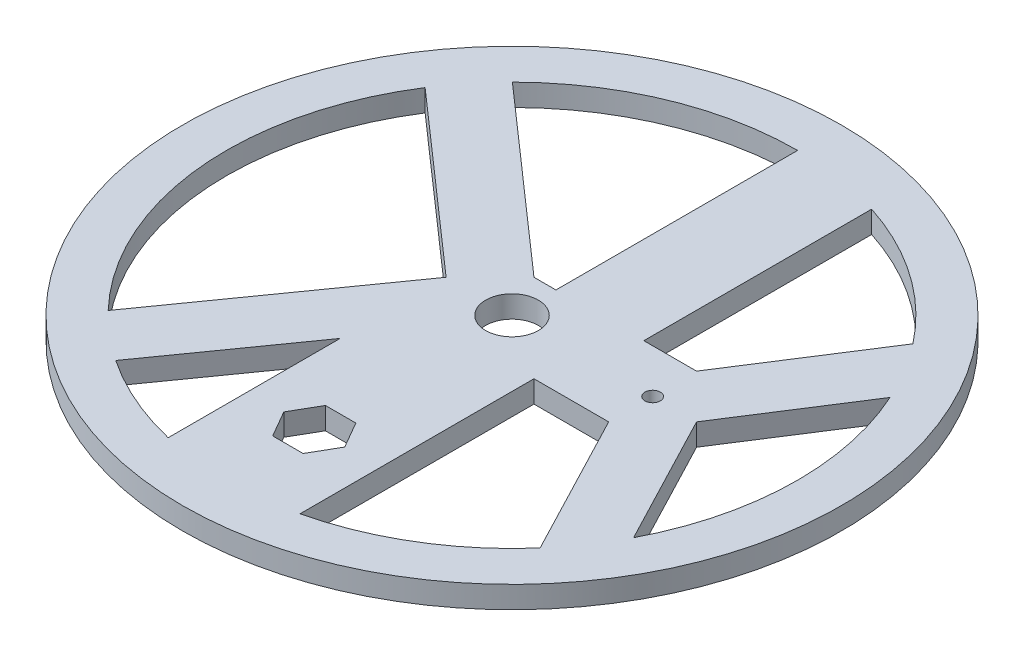
ISO-10303-21;
HEADER;
FILE_DESCRIPTION(('STEP AP214'),'2;1');
FILE_NAME('part.step','',(''),(''),'','','');
FILE_SCHEMA(('AUTOMOTIVE_DESIGN { 1 0 10303 214 1 1 1 1 }'));
ENDSEC;
DATA;
#1=APPLICATION_CONTEXT('core data for automotive mechanical design processes');
#2=APPLICATION_PROTOCOL_DEFINITION('international standard','automotive_design',2000,#1);
#3=PRODUCT_CONTEXT('',#1,'mechanical');
#4=PRODUCT('Part','Part','',(#3));
#5=PRODUCT_RELATED_PRODUCT_CATEGORY('part','',(#4));
#6=PRODUCT_DEFINITION_FORMATION('','',#4);
#7=PRODUCT_DEFINITION_CONTEXT('part definition',#1,'design');
#8=PRODUCT_DEFINITION('design','',#6,#7);
#9=PRODUCT_DEFINITION_SHAPE('','',#8);
#10=(LENGTH_UNIT() NAMED_UNIT(*) SI_UNIT(.MILLI.,.METRE.));
#11=(NAMED_UNIT(*) PLANE_ANGLE_UNIT() SI_UNIT($,.RADIAN.));
#12=(NAMED_UNIT(*) SI_UNIT($,.STERADIAN.) SOLID_ANGLE_UNIT());
#13=UNCERTAINTY_MEASURE_WITH_UNIT(LENGTH_MEASURE(1.E-05),#10,'distance_accuracy_value','');
#14=(GEOMETRIC_REPRESENTATION_CONTEXT(3) GLOBAL_UNCERTAINTY_ASSIGNED_CONTEXT((#13)) GLOBAL_UNIT_ASSIGNED_CONTEXT((#10,
#11,#12)) REPRESENTATION_CONTEXT('',''));
#15=CARTESIAN_POINT('',(0.,0.,0.));
#16=DIRECTION('',(0.,0.,1.));
#17=DIRECTION('',(1.,0.,0.));
#18=AXIS2_PLACEMENT_3D('',#15,#16,#17);
#19=CARTESIAN_POINT('',(0.,5.,0.));
#20=DIRECTION('',(0.,1.,0.));
#21=DIRECTION('',(0.,0.,1.));
#22=AXIS2_PLACEMENT_3D('',#19,#20,#21);
#23=PLANE('',#22);
#24=DIRECTION('',(0.,0.,1.));
#25=VECTOR('',#24,1.);
#26=CARTESIAN_POINT('',(15.,5.,0.));
#27=LINE('',#26,#25);
#28=CARTESIAN_POINT('',(15.,5.,10.));
#29=VERTEX_POINT('',#28);
#30=CARTESIAN_POINT('',(15.,5.,63.2455532033676));
#31=VERTEX_POINT('',#30);
#32=EDGE_CURVE('E134',#29,#31,#27,.T.);
#33=ORIENTED_EDGE('',*,*,#32,.F.);
#34=DIRECTION('',(1.,0.,0.));
#35=VECTOR('',#34,1.);
#36=CARTESIAN_POINT('',(0.,5.,10.));
#37=LINE('',#36,#35);
#38=CARTESIAN_POINT('',(32.,5.,10.));
#39=VERTEX_POINT('',#38);
#40=EDGE_CURVE('E358',#29,#39,#37,.T.);
#41=ORIENTED_EDGE('',*,*,#40,.T.);
#42=DIRECTION('',(0.462813092715628,0.,0.886455887910389));
#43=VECTOR('',#42,1.);
#44=CARTESIAN_POINT('',(21.043095408354,5.,-10.9864689253831));
#45=LINE('',#44,#43);
#46=CARTESIAN_POINT('',(49.0480133056651,5.,42.6531639010202));
#47=VERTEX_POINT('',#46);
#48=EDGE_CURVE('E371',#39,#47,#45,.T.);
#49=ORIENTED_EDGE('',*,*,#48,.T.);
#50=CARTESIAN_POINT('',(0.,5.,0.));
#51=DIRECTION('',(0.,1.,0.));
#52=DIRECTION('',(0.,0.,1.));
#53=AXIS2_PLACEMENT_3D('',#50,#51,#52);
#54=CIRCLE('',#53,65.);
#55=EDGE_CURVE('E368',#31,#47,#54,.T.);
#56=ORIENTED_EDGE('',*,*,#55,.F.);
#57=EDGE_LOOP('',(#33,#41,#49,#56));
#58=FACE_BOUND('',#57,.T.);
#59=DIRECTION('',(0.462813092715629,0.,0.886455887910388));
#60=VECTOR('',#59,1.);
#61=CARTESIAN_POINT('',(33.0037697308618,5.,-17.231062423671));
#62=LINE('',#61,#60);
#63=CARTESIAN_POINT('',(42.,5.,0.));
#64=VERTEX_POINT('',#63);
#65=CARTESIAN_POINT('',(57.662812973354,5.,30.));
#66=VERTEX_POINT('',#65);
#67=EDGE_CURVE('E142',#64,#66,#62,.T.);
#68=ORIENTED_EDGE('',*,*,#67,.F.);
#69=DIRECTION('',(0.539745359981986,0.,-0.84182833545677));
#70=VECTOR('',#69,1.);
#71=CARTESIAN_POINT('',(29.7643477478725,5.,19.0836633944943));
#72=LINE('',#71,#70);
#73=CARTESIAN_POINT('',(59.2034738048556,5.,-26.8318595970868));
#74=VERTEX_POINT('',#73);
#75=EDGE_CURVE('E336',#64,#74,#72,.T.);
#76=ORIENTED_EDGE('',*,*,#75,.T.);
#77=CARTESIAN_POINT('',(0.,5.,0.));
#78=DIRECTION('',(0.,1.,0.));
#79=DIRECTION('',(0.,0.,1.));
#80=AXIS2_PLACEMENT_3D('',#77,#78,#79);
#81=CIRCLE('',#80,65.);
#82=EDGE_CURVE('E344',#66,#74,#81,.T.);
#83=ORIENTED_EDGE('',*,*,#82,.F.);
#84=EDGE_LOOP('',(#68,#76,#83));
#85=FACE_BOUND('',#84,.T.);
#86=DIRECTION('',(0.539745359981986,0.,-0.84182833545677));
#87=VECTOR('',#86,1.);
#88=CARTESIAN_POINT('',(18.1338689044518,5.,11.626683478632));
#89=LINE('',#88,#87);
#90=CARTESIAN_POINT('',(32.,5.,-10.));
#91=VERTEX_POINT('',#90);
#92=CARTESIAN_POINT('',(51.234753829798,5.,-40.));
#93=VERTEX_POINT('',#92);
#94=EDGE_CURVE('E378',#91,#93,#89,.T.);
#95=ORIENTED_EDGE('',*,*,#94,.F.);
#96=DIRECTION('',(1.,0.,0.));
#97=VECTOR('',#96,1.);
#98=CARTESIAN_POINT('',(0.,5.,-10.));
#99=LINE('',#98,#97);
#100=CARTESIAN_POINT('',(20.,5.,-10.));
#101=VERTEX_POINT('',#100);
#102=EDGE_CURVE('E422',#101,#91,#99,.T.);
#103=ORIENTED_EDGE('',*,*,#102,.F.);
#104=DIRECTION('',(0.,0.,-1.));
#105=VECTOR('',#104,1.);
#106=CARTESIAN_POINT('',(20.,5.,0.));
#107=LINE('',#106,#105);
#108=CARTESIAN_POINT('',(20.,5.,-61.8465843842649));
#109=VERTEX_POINT('',#108);
#110=EDGE_CURVE('E436',#101,#109,#107,.T.);
#111=ORIENTED_EDGE('',*,*,#110,.T.);
#112=CARTESIAN_POINT('',(0.,5.,0.));
#113=DIRECTION('',(0.,1.,0.));
#114=DIRECTION('',(0.,0.,1.));
#115=AXIS2_PLACEMENT_3D('',#112,#113,#114);
#116=CIRCLE('',#115,65.);
#117=EDGE_CURVE('E433',#93,#109,#116,.T.);
#118=ORIENTED_EDGE('',*,*,#117,.F.);
#119=EDGE_LOOP('',(#95,#103,#111,#118));
#120=FACE_BOUND('',#119,.T.);
#121=DIRECTION('',(0.,0.,-1.));
#122=VECTOR('',#121,1.);
#123=CARTESIAN_POINT('',(0.,5.,0.));
#124=LINE('',#123,#122);
#125=CARTESIAN_POINT('',(0.,5.,-10.));
#126=VERTEX_POINT('',#125);
#127=CARTESIAN_POINT('',(0.,5.,-65.));
#128=VERTEX_POINT('',#127);
#129=EDGE_CURVE('E398',#126,#128,#124,.T.);
#130=ORIENTED_EDGE('',*,*,#129,.F.);
#131=DIRECTION('',(1.,0.,0.));
#132=VECTOR('',#131,1.);
#133=CARTESIAN_POINT('',(0.,5.,-10.));
#134=LINE('',#133,#132);
#135=CARTESIAN_POINT('',(-5.,5.,-10.));
#136=VERTEX_POINT('',#135);
#137=EDGE_CURVE('E388',#136,#126,#134,.T.);
#138=ORIENTED_EDGE('',*,*,#137,.F.);
#139=DIRECTION('',(-0.750709632654764,0.,-0.66063230880676));
#140=VECTOR('',#139,1.);
#141=CARTESIAN_POINT('',(2.77725514144516,5.,-3.15593433628555));
#142=LINE('',#141,#140);
#143=CARTESIAN_POINT('',(-45.9167075544969,5.,-46.0071295274418));
#144=VERTEX_POINT('',#143);
#145=EDGE_CURVE('E404',#136,#144,#142,.T.);
#146=ORIENTED_EDGE('',*,*,#145,.T.);
#147=CARTESIAN_POINT('',(0.,5.,0.));
#148=DIRECTION('',(0.,1.,0.));
#149=DIRECTION('',(0.,0.,1.));
#150=AXIS2_PLACEMENT_3D('',#147,#148,#149);
#151=CIRCLE('',#150,65.);
#152=EDGE_CURVE('E400',#128,#144,#151,.T.);
#153=ORIENTED_EDGE('',*,*,#152,.F.);
#154=EDGE_LOOP('',(#130,#138,#146,#153));
#155=FACE_BOUND('',#154,.T.);
#156=DIRECTION('',(-0.57836926543929,0.,0.815775087138125));
#157=VECTOR('',#156,1.);
#158=CARTESIAN_POINT('',(1.39074741514143,5.,0.986013882489091));
#159=LINE('',#158,#157);
#160=CARTESIAN_POINT('',(-15.,5.,24.1047447692179));
#161=VERTEX_POINT('',#160);
#162=CARTESIAN_POINT('',(-36.1903220489352,5.,53.9931531769942));
#163=VERTEX_POINT('',#162);
#164=EDGE_CURVE('E305',#161,#163,#159,.T.);
#165=ORIENTED_EDGE('',*,*,#164,.F.);
#166=DIRECTION('',(0.,0.,1.));
#167=VECTOR('',#166,1.);
#168=CARTESIAN_POINT('',(-15.,5.,0.));
#169=LINE('',#168,#167);
#170=CARTESIAN_POINT('',(-15.,5.,63.2455532033676));
#171=VERTEX_POINT('',#170);
#172=EDGE_CURVE('E320',#161,#171,#169,.T.);
#173=ORIENTED_EDGE('',*,*,#172,.T.);
#174=CARTESIAN_POINT('',(0.,5.,0.));
#175=DIRECTION('',(0.,1.,0.));
#176=DIRECTION('',(0.,0.,1.));
#177=AXIS2_PLACEMENT_3D('',#174,#175,#176);
#178=CIRCLE('',#177,65.);
#179=EDGE_CURVE('E323',#163,#171,#178,.T.);
#180=ORIENTED_EDGE('',*,*,#179,.F.);
#181=EDGE_LOOP('',(#165,#173,#180));
#182=FACE_BOUND('',#181,.T.);
#183=DIRECTION('',(0.5,0.,-0.866025403784439));
#184=VECTOR('',#183,1.);
#185=CARTESIAN_POINT('',(3.46410161513776,5.,51.));
#186=LINE('',#185,#184);
#187=CARTESIAN_POINT('',(3.46410161513776,5.,51.));
#188=VERTEX_POINT('',#187);
#189=CARTESIAN_POINT('',(6.92820323027551,5.,45.));
#190=VERTEX_POINT('',#189);
#191=EDGE_CURVE('E481',#188,#190,#186,.T.);
#192=ORIENTED_EDGE('',*,*,#191,.F.);
#193=DIRECTION('',(1.,0.,0.));
#194=VECTOR('',#193,1.);
#195=CARTESIAN_POINT('',(-3.46410161513776,5.,51.));
#196=LINE('',#195,#194);
#197=CARTESIAN_POINT('',(-3.46410161513776,5.,51.));
#198=VERTEX_POINT('',#197);
#199=EDGE_CURVE('E479',#198,#188,#196,.T.);
#200=ORIENTED_EDGE('',*,*,#199,.F.);
#201=DIRECTION('',(0.5,0.,0.866025403784439));
#202=VECTOR('',#201,1.);
#203=CARTESIAN_POINT('',(-6.92820323027552,5.,45.));
#204=LINE('',#203,#202);
#205=CARTESIAN_POINT('',(-6.92820323027552,5.,45.));
#206=VERTEX_POINT('',#205);
#207=EDGE_CURVE('E491',#206,#198,#204,.T.);
#208=ORIENTED_EDGE('',*,*,#207,.F.);
#209=DIRECTION('',(-0.5,0.,0.866025403784439));
#210=VECTOR('',#209,1.);
#211=CARTESIAN_POINT('',(-3.46410161513776,5.,39.));
#212=LINE('',#211,#210);
#213=CARTESIAN_POINT('',(-3.46410161513776,5.,39.));
#214=VERTEX_POINT('',#213);
#215=EDGE_CURVE('E488',#214,#206,#212,.T.);
#216=ORIENTED_EDGE('',*,*,#215,.F.);
#217=DIRECTION('',(-1.,0.,0.));
#218=VECTOR('',#217,1.);
#219=CARTESIAN_POINT('',(3.46410161513775,5.,39.));
#220=LINE('',#219,#218);
#221=CARTESIAN_POINT('',(3.46410161513775,5.,39.));
#222=VERTEX_POINT('',#221);
#223=EDGE_CURVE('E486',#222,#214,#220,.T.);
#224=ORIENTED_EDGE('',*,*,#223,.F.);
#225=DIRECTION('',(-0.5,0.,-0.866025403784439));
#226=VECTOR('',#225,1.);
#227=CARTESIAN_POINT('',(6.92820323027551,5.,45.));
#228=LINE('',#227,#226);
#229=EDGE_CURVE('E484',#190,#222,#228,.T.);
#230=ORIENTED_EDGE('',*,*,#229,.F.);
#231=EDGE_LOOP('',(#192,#200,#208,#216,#224,#230));
#232=FACE_BOUND('',#231,.T.);
#233=CARTESIAN_POINT('',(32.,5.,0.));
#234=DIRECTION('',(0.,1.,0.));
#235=DIRECTION('',(0.,0.,1.));
#236=AXIS2_PLACEMENT_3D('',#233,#234,#235);
#237=CIRCLE('',#236,1.75);
#238=CARTESIAN_POINT('',(32.,5.,1.75));
#239=VERTEX_POINT('',#238);
#240=EDGE_CURVE('E524',#239,#239,#237,.T.);
#241=ORIENTED_EDGE('',*,*,#240,.F.);
#242=EDGE_LOOP('',(#241));
#243=FACE_BOUND('',#242,.T.);
#244=CARTESIAN_POINT('',(0.,5.,0.));
#245=DIRECTION('',(0.,1.,0.));
#246=DIRECTION('',(0.,0.,1.));
#247=AXIS2_PLACEMENT_3D('',#244,#245,#246);
#248=CIRCLE('',#247,75.);
#249=CARTESIAN_POINT('',(0.,5.,75.));
#250=VERTEX_POINT('',#249);
#251=EDGE_CURVE('E12',#250,#250,#248,.T.);
#252=ORIENTED_EDGE('',*,*,#251,.T.);
#253=EDGE_LOOP('',(#252));
#254=FACE_BOUND('',#253,.T.);
#255=CARTESIAN_POINT('',(0.,5.,0.));
#256=DIRECTION('',(0.,1.,0.));
#257=DIRECTION('',(0.,0.,1.));
#258=AXIS2_PLACEMENT_3D('',#255,#256,#257);
#259=CIRCLE('',#258,6.);
#260=CARTESIAN_POINT('',(0.,5.,6.));
#261=VERTEX_POINT('',#260);
#262=EDGE_CURVE('E473',#261,#261,#259,.T.);
#263=ORIENTED_EDGE('',*,*,#262,.F.);
#264=EDGE_LOOP('',(#263));
#265=FACE_BOUND('',#264,.T.);
#266=CARTESIAN_POINT('',(0.,5.,0.));
#267=DIRECTION('',(0.,1.,0.));
#268=DIRECTION('',(0.,0.,1.));
#269=AXIS2_PLACEMENT_3D('',#266,#267,#268);
#270=CIRCLE('',#269,65.);
#271=CARTESIAN_POINT('',(-54.7722557505166,5.,-35.));
#272=VERTEX_POINT('',#271);
#273=CARTESIAN_POINT('',(-46.9041575982343,5.,45.));
#274=VERTEX_POINT('',#273);
#275=EDGE_CURVE('E460',#272,#274,#270,.T.);
#276=ORIENTED_EDGE('',*,*,#275,.F.);
#277=DIRECTION('',(0.750709632654764,0.,0.66063230880676));
#278=VECTOR('',#277,1.);
#279=CARTESIAN_POINT('',(-6.54652571159025,5.,7.43914556796286));
#280=LINE('',#279,#278);
#281=CARTESIAN_POINT('',(-15.,5.,0.));
#282=VERTEX_POINT('',#281);
#283=EDGE_CURVE('E411',#272,#282,#280,.T.);
#284=ORIENTED_EDGE('',*,*,#283,.T.);
#285=DIRECTION('',(-0.57836926543929,0.,0.815775087138125));
#286=VECTOR('',#285,1.);
#287=CARTESIAN_POINT('',(-9.98233489192824,5.,-7.07728856867626));
#288=LINE('',#287,#286);
#289=EDGE_CURVE('E451',#282,#274,#288,.T.);
#290=ORIENTED_EDGE('',*,*,#289,.T.);
#291=EDGE_LOOP('',(#276,#284,#290));
#292=FACE_BOUND('',#291,.T.);
#293=ADVANCED_FACE('F119',(#58,#85,#120,#155,#182,#232,#243,#254,#265,#292),#23,.T.);
#294=CARTESIAN_POINT('',(0.,0.,0.));
#295=DIRECTION('',(0.,1.,0.));
#296=DIRECTION('',(0.,0.,1.));
#297=AXIS2_PLACEMENT_3D('',#294,#295,#296);
#298=PLANE('',#297);
#299=DIRECTION('',(1.,0.,0.));
#300=VECTOR('',#299,1.);
#301=CARTESIAN_POINT('',(0.,0.,10.));
#302=LINE('',#301,#300);
#303=CARTESIAN_POINT('',(15.,0.,10.));
#304=VERTEX_POINT('',#303);
#305=CARTESIAN_POINT('',(32.,0.,10.));
#306=VERTEX_POINT('',#305);
#307=EDGE_CURVE('E364',#304,#306,#302,.T.);
#308=ORIENTED_EDGE('',*,*,#307,.F.);
#309=DIRECTION('',(0.,0.,1.));
#310=VECTOR('',#309,1.);
#311=CARTESIAN_POINT('',(15.,0.,0.));
#312=LINE('',#311,#310);
#313=CARTESIAN_POINT('',(15.,0.,63.2455532033676));
#314=VERTEX_POINT('',#313);
#315=EDGE_CURVE('E354',#304,#314,#312,.T.);
#316=ORIENTED_EDGE('',*,*,#315,.T.);
#317=CARTESIAN_POINT('',(0.,0.,0.));
#318=DIRECTION('',(0.,1.,0.));
#319=DIRECTION('',(0.,0.,1.));
#320=AXIS2_PLACEMENT_3D('',#317,#318,#319);
#321=CIRCLE('',#320,65.);
#322=CARTESIAN_POINT('',(49.0480133056651,0.,42.6531639010202));
#323=VERTEX_POINT('',#322);
#324=EDGE_CURVE('E357',#314,#323,#321,.T.);
#325=ORIENTED_EDGE('',*,*,#324,.T.);
#326=DIRECTION('',(0.462813092715628,0.,0.886455887910389));
#327=VECTOR('',#326,1.);
#328=CARTESIAN_POINT('',(21.043095408354,0.,-10.9864689253831));
#329=LINE('',#328,#327);
#330=EDGE_CURVE('E361',#306,#323,#329,.T.);
#331=ORIENTED_EDGE('',*,*,#330,.F.);
#332=EDGE_LOOP('',(#308,#316,#325,#331));
#333=FACE_BOUND('',#332,.T.);
#334=DIRECTION('',(0.539745359981986,0.,-0.84182833545677));
#335=VECTOR('',#334,1.);
#336=CARTESIAN_POINT('',(29.7643477478725,0.,19.0836633944943));
#337=LINE('',#336,#335);
#338=CARTESIAN_POINT('',(42.,0.,0.));
#339=VERTEX_POINT('',#338);
#340=CARTESIAN_POINT('',(59.2034738048556,0.,-26.8318595970868));
#341=VERTEX_POINT('',#340);
#342=EDGE_CURVE('E339',#339,#341,#337,.T.);
#343=ORIENTED_EDGE('',*,*,#342,.F.);
#344=DIRECTION('',(0.462813092715629,0.,0.886455887910388));
#345=VECTOR('',#344,1.);
#346=CARTESIAN_POINT('',(33.0037697308618,0.,-17.231062423671));
#347=LINE('',#346,#345);
#348=CARTESIAN_POINT('',(57.662812973354,0.,30.));
#349=VERTEX_POINT('',#348);
#350=EDGE_CURVE('E332',#339,#349,#347,.T.);
#351=ORIENTED_EDGE('',*,*,#350,.T.);
#352=CARTESIAN_POINT('',(0.,0.,0.));
#353=DIRECTION('',(0.,1.,0.));
#354=DIRECTION('',(0.,0.,1.));
#355=AXIS2_PLACEMENT_3D('',#352,#353,#354);
#356=CIRCLE('',#355,65.);
#357=EDGE_CURVE('E335',#349,#341,#356,.T.);
#358=ORIENTED_EDGE('',*,*,#357,.T.);
#359=EDGE_LOOP('',(#343,#351,#358));
#360=FACE_BOUND('',#359,.T.);
#361=DIRECTION('',(1.,0.,0.));
#362=VECTOR('',#361,1.);
#363=CARTESIAN_POINT('',(0.,0.,-10.));
#364=LINE('',#363,#362);
#365=CARTESIAN_POINT('',(20.,0.,-10.));
#366=VERTEX_POINT('',#365);
#367=CARTESIAN_POINT('',(32.,0.,-10.));
#368=VERTEX_POINT('',#367);
#369=EDGE_CURVE('E428',#366,#368,#364,.T.);
#370=ORIENTED_EDGE('',*,*,#369,.T.);
#371=DIRECTION('',(0.539745359981986,0.,-0.84182833545677));
#372=VECTOR('',#371,1.);
#373=CARTESIAN_POINT('',(18.1338689044518,0.,11.626683478632));
#374=LINE('',#373,#372);
#375=CARTESIAN_POINT('',(51.234753829798,0.,-40.));
#376=VERTEX_POINT('',#375);
#377=EDGE_CURVE('E418',#368,#376,#374,.T.);
#378=ORIENTED_EDGE('',*,*,#377,.T.);
#379=CARTESIAN_POINT('',(0.,0.,0.));
#380=DIRECTION('',(0.,1.,0.));
#381=DIRECTION('',(0.,0.,1.));
#382=AXIS2_PLACEMENT_3D('',#379,#380,#381);
#383=CIRCLE('',#382,65.);
#384=CARTESIAN_POINT('',(20.,0.,-61.8465843842649));
#385=VERTEX_POINT('',#384);
#386=EDGE_CURVE('E421',#376,#385,#383,.T.);
#387=ORIENTED_EDGE('',*,*,#386,.T.);
#388=DIRECTION('',(0.,0.,-1.));
#389=VECTOR('',#388,1.);
#390=CARTESIAN_POINT('',(20.,0.,0.));
#391=LINE('',#390,#389);
#392=EDGE_CURVE('E425',#366,#385,#391,.T.);
#393=ORIENTED_EDGE('',*,*,#392,.F.);
#394=EDGE_LOOP('',(#370,#378,#387,#393));
#395=FACE_BOUND('',#394,.T.);
#396=DIRECTION('',(1.,0.,0.));
#397=VECTOR('',#396,1.);
#398=CARTESIAN_POINT('',(0.,0.,-10.));
#399=LINE('',#398,#397);
#400=CARTESIAN_POINT('',(-5.,0.,-10.));
#401=VERTEX_POINT('',#400);
#402=CARTESIAN_POINT('',(0.,0.,-10.));
#403=VERTEX_POINT('',#402);
#404=EDGE_CURVE('E394',#401,#403,#399,.T.);
#405=ORIENTED_EDGE('',*,*,#404,.T.);
#406=DIRECTION('',(0.,0.,-1.));
#407=VECTOR('',#406,1.);
#408=CARTESIAN_POINT('',(0.,0.,0.));
#409=LINE('',#408,#407);
#410=CARTESIAN_POINT('',(0.,0.,-65.));
#411=VERTEX_POINT('',#410);
#412=EDGE_CURVE('E384',#403,#411,#409,.T.);
#413=ORIENTED_EDGE('',*,*,#412,.T.);
#414=CARTESIAN_POINT('',(0.,0.,0.));
#415=DIRECTION('',(0.,1.,0.));
#416=DIRECTION('',(0.,0.,1.));
#417=AXIS2_PLACEMENT_3D('',#414,#415,#416);
#418=CIRCLE('',#417,65.);
#419=CARTESIAN_POINT('',(-45.9167075544969,0.,-46.0071295274418));
#420=VERTEX_POINT('',#419);
#421=EDGE_CURVE('E387',#411,#420,#418,.T.);
#422=ORIENTED_EDGE('',*,*,#421,.T.);
#423=DIRECTION('',(-0.750709632654764,0.,-0.66063230880676));
#424=VECTOR('',#423,1.);
#425=CARTESIAN_POINT('',(2.77725514144516,0.,-3.15593433628555));
#426=LINE('',#425,#424);
#427=EDGE_CURVE('E391',#401,#420,#426,.T.);
#428=ORIENTED_EDGE('',*,*,#427,.F.);
#429=EDGE_LOOP('',(#405,#413,#422,#428));
#430=FACE_BOUND('',#429,.T.);
#431=DIRECTION('',(0.,0.,1.));
#432=VECTOR('',#431,1.);
#433=CARTESIAN_POINT('',(-15.,0.,0.));
#434=LINE('',#433,#432);
#435=CARTESIAN_POINT('',(-15.,0.,24.1047447692179));
#436=VERTEX_POINT('',#435);
#437=CARTESIAN_POINT('',(-15.,0.,63.2455532033676));
#438=VERTEX_POINT('',#437);
#439=EDGE_CURVE('E310',#436,#438,#434,.T.);
#440=ORIENTED_EDGE('',*,*,#439,.F.);
#441=DIRECTION('',(-0.57836926543929,0.,0.815775087138125));
#442=VECTOR('',#441,1.);
#443=CARTESIAN_POINT('',(1.39074741514143,0.,0.986013882489091));
#444=LINE('',#443,#442);
#445=CARTESIAN_POINT('',(-36.1903220489352,0.,53.9931531769942));
#446=VERTEX_POINT('',#445);
#447=EDGE_CURVE('E302',#436,#446,#444,.T.);
#448=ORIENTED_EDGE('',*,*,#447,.T.);
#449=CARTESIAN_POINT('',(0.,0.,0.));
#450=DIRECTION('',(0.,1.,0.));
#451=DIRECTION('',(0.,0.,1.));
#452=AXIS2_PLACEMENT_3D('',#449,#450,#451);
#453=CIRCLE('',#452,65.);
#454=EDGE_CURVE('E313',#446,#438,#453,.T.);
#455=ORIENTED_EDGE('',*,*,#454,.T.);
#456=EDGE_LOOP('',(#440,#448,#455));
#457=FACE_BOUND('',#456,.T.);
#458=CARTESIAN_POINT('',(0.,0.,0.));
#459=DIRECTION('',(0.,1.,0.));
#460=DIRECTION('',(0.,0.,1.));
#461=AXIS2_PLACEMENT_3D('',#458,#459,#460);
#462=CIRCLE('',#461,6.);
#463=CARTESIAN_POINT('',(0.,0.,6.));
#464=VERTEX_POINT('',#463);
#465=EDGE_CURVE('E468',#464,#464,#462,.T.);
#466=ORIENTED_EDGE('',*,*,#465,.T.);
#467=EDGE_LOOP('',(#466));
#468=FACE_BOUND('',#467,.T.);
#469=DIRECTION('',(1.,0.,0.));
#470=VECTOR('',#469,1.);
#471=CARTESIAN_POINT('',(-3.46410161513776,0.,51.));
#472=LINE('',#471,#470);
#473=CARTESIAN_POINT('',(-3.46410161513776,0.,51.));
#474=VERTEX_POINT('',#473);
#475=CARTESIAN_POINT('',(3.46410161513776,0.,51.));
#476=VERTEX_POINT('',#475);
#477=EDGE_CURVE('E476',#474,#476,#472,.T.);
#478=ORIENTED_EDGE('',*,*,#477,.T.);
#479=DIRECTION('',(0.5,0.,-0.866025403784439));
#480=VECTOR('',#479,1.);
#481=CARTESIAN_POINT('',(3.46410161513776,0.,51.));
#482=LINE('',#481,#480);
#483=CARTESIAN_POINT('',(6.92820323027551,0.,45.));
#484=VERTEX_POINT('',#483);
#485=EDGE_CURVE('E496',#476,#484,#482,.T.);
#486=ORIENTED_EDGE('',*,*,#485,.T.);
#487=DIRECTION('',(-0.5,0.,-0.866025403784439));
#488=VECTOR('',#487,1.);
#489=CARTESIAN_POINT('',(6.92820323027551,0.,45.));
#490=LINE('',#489,#488);
#491=CARTESIAN_POINT('',(3.46410161513775,0.,39.));
#492=VERTEX_POINT('',#491);
#493=EDGE_CURVE('E499',#484,#492,#490,.T.);
#494=ORIENTED_EDGE('',*,*,#493,.T.);
#495=DIRECTION('',(-1.,0.,0.));
#496=VECTOR('',#495,1.);
#497=CARTESIAN_POINT('',(3.46410161513775,0.,39.));
#498=LINE('',#497,#496);
#499=CARTESIAN_POINT('',(-3.46410161513776,0.,39.));
#500=VERTEX_POINT('',#499);
#501=EDGE_CURVE('E502',#492,#500,#498,.T.);
#502=ORIENTED_EDGE('',*,*,#501,.T.);
#503=DIRECTION('',(-0.5,0.,0.866025403784439));
#504=VECTOR('',#503,1.);
#505=CARTESIAN_POINT('',(-3.46410161513776,0.,39.));
#506=LINE('',#505,#504);
#507=CARTESIAN_POINT('',(-6.92820323027552,0.,45.));
#508=VERTEX_POINT('',#507);
#509=EDGE_CURVE('E505',#500,#508,#506,.T.);
#510=ORIENTED_EDGE('',*,*,#509,.T.);
#511=DIRECTION('',(0.5,0.,0.866025403784439));
#512=VECTOR('',#511,1.);
#513=CARTESIAN_POINT('',(-6.92820323027552,0.,45.));
#514=LINE('',#513,#512);
#515=EDGE_CURVE('E482',#508,#474,#514,.T.);
#516=ORIENTED_EDGE('',*,*,#515,.T.);
#517=EDGE_LOOP('',(#478,#486,#494,#502,#510,#516));
#518=FACE_BOUND('',#517,.T.);
#519=CARTESIAN_POINT('',(0.,0.,0.));
#520=DIRECTION('',(0.,1.,0.));
#521=DIRECTION('',(0.,0.,1.));
#522=AXIS2_PLACEMENT_3D('',#519,#520,#521);
#523=CIRCLE('',#522,75.);
#524=CARTESIAN_POINT('',(0.,0.,75.));
#525=VERTEX_POINT('',#524);
#526=EDGE_CURVE('E123',#525,#525,#523,.T.);
#527=ORIENTED_EDGE('',*,*,#526,.F.);
#528=EDGE_LOOP('',(#527));
#529=FACE_BOUND('',#528,.T.);
#530=CARTESIAN_POINT('',(32.,0.,0.));
#531=DIRECTION('',(0.,1.,0.));
#532=DIRECTION('',(0.,0.,1.));
#533=AXIS2_PLACEMENT_3D('',#530,#531,#532);
#534=CIRCLE('',#533,1.75);
#535=CARTESIAN_POINT('',(32.,0.,1.75));
#536=VERTEX_POINT('',#535);
#537=EDGE_CURVE('E523',#536,#536,#534,.T.);
#538=ORIENTED_EDGE('',*,*,#537,.T.);
#539=EDGE_LOOP('',(#538));
#540=FACE_BOUND('',#539,.T.);
#541=DIRECTION('',(0.750709632654764,0.,0.66063230880676));
#542=VECTOR('',#541,1.);
#543=CARTESIAN_POINT('',(-6.54652571159025,0.,7.43914556796286));
#544=LINE('',#543,#542);
#545=CARTESIAN_POINT('',(-54.7722557505166,0.,-35.));
#546=VERTEX_POINT('',#545);
#547=CARTESIAN_POINT('',(-15.,0.,0.));
#548=VERTEX_POINT('',#547);
#549=EDGE_CURVE('E448',#546,#548,#544,.T.);
#550=ORIENTED_EDGE('',*,*,#549,.F.);
#551=CARTESIAN_POINT('',(0.,0.,0.));
#552=DIRECTION('',(0.,1.,0.));
#553=DIRECTION('',(0.,0.,1.));
#554=AXIS2_PLACEMENT_3D('',#551,#552,#553);
#555=CIRCLE('',#554,65.);
#556=CARTESIAN_POINT('',(-46.9041575982343,0.,45.));
#557=VERTEX_POINT('',#556);
#558=EDGE_CURVE('E450',#546,#557,#555,.T.);
#559=ORIENTED_EDGE('',*,*,#558,.T.);
#560=DIRECTION('',(-0.57836926543929,0.,0.815775087138125));
#561=VECTOR('',#560,1.);
#562=CARTESIAN_POINT('',(-9.98233489192824,0.,-7.07728856867626));
#563=LINE('',#562,#561);
#564=EDGE_CURVE('E454',#548,#557,#563,.T.);
#565=ORIENTED_EDGE('',*,*,#564,.F.);
#566=EDGE_LOOP('',(#550,#559,#565));
#567=FACE_BOUND('',#566,.T.);
#568=ADVANCED_FACE('F318',(#333,#360,#395,#430,#457,#468,#518,#529,#540,#567),#298,.F.);
#569=CARTESIAN_POINT('',(0.,5.,0.));
#570=DIRECTION('',(0.,-1.,0.));
#571=DIRECTION('',(0.,0.,-1.));
#572=AXIS2_PLACEMENT_3D('',#569,#570,#571);
#573=CYLINDRICAL_SURFACE('',#572,75.);
#574=ORIENTED_EDGE('',*,*,#251,.F.);
#575=EDGE_LOOP('',(#574));
#576=FACE_BOUND('',#575,.T.);
#577=ORIENTED_EDGE('',*,*,#526,.T.);
#578=EDGE_LOOP('',(#577));
#579=FACE_BOUND('',#578,.T.);
#580=ADVANCED_FACE('F121',(#576,#579),#573,.T.);
#581=CARTESIAN_POINT('',(32.,5.,0.));
#582=DIRECTION('',(0.,-1.,0.));
#583=DIRECTION('',(0.,0.,-1.));
#584=AXIS2_PLACEMENT_3D('',#581,#582,#583);
#585=CYLINDRICAL_SURFACE('',#584,1.75);
#586=ORIENTED_EDGE('',*,*,#240,.T.);
#587=EDGE_LOOP('',(#586));
#588=FACE_BOUND('',#587,.T.);
#589=ORIENTED_EDGE('',*,*,#537,.F.);
#590=EDGE_LOOP('',(#589));
#591=FACE_BOUND('',#590,.T.);
#592=ADVANCED_FACE('F532',(#588,#591),#585,.F.);
#593=CARTESIAN_POINT('',(-3.46410161513776,5.,51.));
#594=DIRECTION('',(0.,0.,-1.));
#595=DIRECTION('',(-1.,0.,0.));
#596=AXIS2_PLACEMENT_3D('',#593,#594,#595);
#597=PLANE('',#596);
#598=ORIENTED_EDGE('',*,*,#477,.F.);
#599=DIRECTION('',(0.,-1.,0.));
#600=VECTOR('',#599,1.);
#601=CARTESIAN_POINT('',(-3.46410161513776,5.,51.));
#602=LINE('',#601,#600);
#603=EDGE_CURVE('E493',#198,#474,#602,.T.);
#604=ORIENTED_EDGE('',*,*,#603,.F.);
#605=ORIENTED_EDGE('',*,*,#199,.T.);
#606=DIRECTION('',(0.,-1.,0.));
#607=VECTOR('',#606,1.);
#608=CARTESIAN_POINT('',(3.46410161513776,5.,51.));
#609=LINE('',#608,#607);
#610=EDGE_CURVE('E520',#188,#476,#609,.T.);
#611=ORIENTED_EDGE('',*,*,#610,.T.);
#612=EDGE_LOOP('',(#598,#604,#605,#611));
#613=FACE_BOUND('',#612,.T.);
#614=ADVANCED_FACE('F534',(#613),#597,.T.);
#615=CARTESIAN_POINT('',(3.46410161513776,5.,51.));
#616=DIRECTION('',(-0.866025403784439,0.,-0.5));
#617=DIRECTION('',(-0.5,0.,0.866025403784439));
#618=AXIS2_PLACEMENT_3D('',#615,#616,#617);
#619=PLANE('',#618);
#620=ORIENTED_EDGE('',*,*,#485,.F.);
#621=ORIENTED_EDGE('',*,*,#610,.F.);
#622=ORIENTED_EDGE('',*,*,#191,.T.);
#623=DIRECTION('',(0.,-1.,0.));
#624=VECTOR('',#623,1.);
#625=CARTESIAN_POINT('',(6.92820323027551,5.,45.));
#626=LINE('',#625,#624);
#627=EDGE_CURVE('E518',#190,#484,#626,.T.);
#628=ORIENTED_EDGE('',*,*,#627,.T.);
#629=EDGE_LOOP('',(#620,#621,#622,#628));
#630=FACE_BOUND('',#629,.T.);
#631=ADVANCED_FACE('F541',(#630),#619,.T.);
#632=CARTESIAN_POINT('',(6.92820323027551,5.,45.));
#633=DIRECTION('',(-0.866025403784439,0.,0.5));
#634=DIRECTION('',(0.5,0.,0.866025403784439));
#635=AXIS2_PLACEMENT_3D('',#632,#633,#634);
#636=PLANE('',#635);
#637=ORIENTED_EDGE('',*,*,#493,.F.);
#638=ORIENTED_EDGE('',*,*,#627,.F.);
#639=ORIENTED_EDGE('',*,*,#229,.T.);
#640=DIRECTION('',(0.,-1.,0.));
#641=VECTOR('',#640,1.);
#642=CARTESIAN_POINT('',(3.46410161513775,5.,39.));
#643=LINE('',#642,#641);
#644=EDGE_CURVE('E516',#222,#492,#643,.T.);
#645=ORIENTED_EDGE('',*,*,#644,.T.);
#646=EDGE_LOOP('',(#637,#638,#639,#645));
#647=FACE_BOUND('',#646,.T.);
#648=ADVANCED_FACE('F613',(#647),#636,.T.);
#649=CARTESIAN_POINT('',(3.46410161513775,5.,39.));
#650=DIRECTION('',(0.,0.,1.));
#651=DIRECTION('',(1.,0.,0.));
#652=AXIS2_PLACEMENT_3D('',#649,#650,#651);
#653=PLANE('',#652);
#654=ORIENTED_EDGE('',*,*,#501,.F.);
#655=ORIENTED_EDGE('',*,*,#644,.F.);
#656=ORIENTED_EDGE('',*,*,#223,.T.);
#657=DIRECTION('',(0.,-1.,0.));
#658=VECTOR('',#657,1.);
#659=CARTESIAN_POINT('',(-3.46410161513776,5.,39.));
#660=LINE('',#659,#658);
#661=EDGE_CURVE('E514',#214,#500,#660,.T.);
#662=ORIENTED_EDGE('',*,*,#661,.T.);
#663=EDGE_LOOP('',(#654,#655,#656,#662));
#664=FACE_BOUND('',#663,.T.);
#665=ADVANCED_FACE('F609',(#664),#653,.T.);
#666=CARTESIAN_POINT('',(-3.46410161513776,5.,39.));
#667=DIRECTION('',(0.866025403784439,0.,0.5));
#668=DIRECTION('',(0.5,0.,-0.866025403784439));
#669=AXIS2_PLACEMENT_3D('',#666,#667,#668);
#670=PLANE('',#669);
#671=ORIENTED_EDGE('',*,*,#509,.F.);
#672=ORIENTED_EDGE('',*,*,#661,.F.);
#673=ORIENTED_EDGE('',*,*,#215,.T.);
#674=DIRECTION('',(0.,-1.,0.));
#675=VECTOR('',#674,1.);
#676=CARTESIAN_POINT('',(-6.92820323027552,5.,45.));
#677=LINE('',#676,#675);
#678=EDGE_CURVE('E512',#206,#508,#677,.T.);
#679=ORIENTED_EDGE('',*,*,#678,.T.);
#680=EDGE_LOOP('',(#671,#672,#673,#679));
#681=FACE_BOUND('',#680,.T.);
#682=ADVANCED_FACE('F605',(#681),#670,.T.);
#683=CARTESIAN_POINT('',(-6.92820323027552,5.,45.));
#684=DIRECTION('',(0.866025403784439,0.,-0.5));
#685=DIRECTION('',(-0.5,0.,-0.866025403784439));
#686=AXIS2_PLACEMENT_3D('',#683,#684,#685);
#687=PLANE('',#686);
#688=ORIENTED_EDGE('',*,*,#515,.F.);
#689=ORIENTED_EDGE('',*,*,#678,.F.);
#690=ORIENTED_EDGE('',*,*,#207,.T.);
#691=ORIENTED_EDGE('',*,*,#603,.T.);
#692=EDGE_LOOP('',(#688,#689,#690,#691));
#693=FACE_BOUND('',#692,.T.);
#694=ADVANCED_FACE('F601',(#693),#687,.T.);
#695=CARTESIAN_POINT('',(0.,5.,0.));
#696=DIRECTION('',(0.,-1.,0.));
#697=DIRECTION('',(0.,0.,-1.));
#698=AXIS2_PLACEMENT_3D('',#695,#696,#697);
#699=CYLINDRICAL_SURFACE('',#698,6.);
#700=ORIENTED_EDGE('',*,*,#262,.T.);
#701=EDGE_LOOP('',(#700));
#702=FACE_BOUND('',#701,.T.);
#703=ORIENTED_EDGE('',*,*,#465,.F.);
#704=EDGE_LOOP('',(#703));
#705=FACE_BOUND('',#704,.T.);
#706=ADVANCED_FACE('F594',(#702,#705),#699,.F.);
#707=CARTESIAN_POINT('',(-6.54652571159025,0.,7.43914556796286));
#708=DIRECTION('',(-0.66063230880676,0.,0.750709632654764));
#709=DIRECTION('',(0.750709632654764,0.,0.66063230880676));
#710=AXIS2_PLACEMENT_3D('',#707,#708,#709);
#711=PLANE('',#710);
#712=ORIENTED_EDGE('',*,*,#283,.F.);
#713=DIRECTION('',(0.,1.,0.));
#714=VECTOR('',#713,1.);
#715=CARTESIAN_POINT('',(-54.7722557505166,0.,-35.));
#716=LINE('',#715,#714);
#717=EDGE_CURVE('E457',#546,#272,#716,.T.);
#718=ORIENTED_EDGE('',*,*,#717,.F.);
#719=ORIENTED_EDGE('',*,*,#549,.T.);
#720=DIRECTION('',(0.,1.,0.));
#721=VECTOR('',#720,1.);
#722=CARTESIAN_POINT('',(-15.,0.,0.));
#723=LINE('',#722,#721);
#724=EDGE_CURVE('E465',#548,#282,#723,.T.);
#725=ORIENTED_EDGE('',*,*,#724,.T.);
#726=EDGE_LOOP('',(#712,#718,#719,#725));
#727=FACE_BOUND('',#726,.T.);
#728=ADVANCED_FACE('F582',(#727),#711,.T.);
#729=CARTESIAN_POINT('',(-9.98233489192824,0.,-7.07728856867626));
#730=DIRECTION('',(-0.815775087138125,0.,-0.57836926543929));
#731=DIRECTION('',(-0.57836926543929,0.,0.815775087138125));
#732=AXIS2_PLACEMENT_3D('',#729,#730,#731);
#733=PLANE('',#732);
#734=ORIENTED_EDGE('',*,*,#289,.F.);
#735=ORIENTED_EDGE('',*,*,#724,.F.);
#736=ORIENTED_EDGE('',*,*,#564,.T.);
#737=DIRECTION('',(0.,1.,0.));
#738=VECTOR('',#737,1.);
#739=CARTESIAN_POINT('',(-46.9041575982343,0.,45.));
#740=LINE('',#739,#738);
#741=EDGE_CURVE('E469',#557,#274,#740,.T.);
#742=ORIENTED_EDGE('',*,*,#741,.T.);
#743=EDGE_LOOP('',(#734,#735,#736,#742));
#744=FACE_BOUND('',#743,.T.);
#745=ADVANCED_FACE('F586',(#744),#733,.T.);
#746=CARTESIAN_POINT('',(0.,0.,0.));
#747=DIRECTION('',(0.,1.,0.));
#748=DIRECTION('',(0.,0.,1.));
#749=AXIS2_PLACEMENT_3D('',#746,#747,#748);
#750=CYLINDRICAL_SURFACE('',#749,65.);
#751=ORIENTED_EDGE('',*,*,#275,.T.);
#752=ORIENTED_EDGE('',*,*,#741,.F.);
#753=ORIENTED_EDGE('',*,*,#558,.F.);
#754=ORIENTED_EDGE('',*,*,#717,.T.);
#755=EDGE_LOOP('',(#751,#752,#753,#754));
#756=FACE_BOUND('',#755,.T.);
#757=ADVANCED_FACE('F578',(#756),#750,.F.);
#758=CARTESIAN_POINT('',(1.39074741514143,0.,0.986013882489091));
#759=DIRECTION('',(-0.815775087138125,0.,-0.57836926543929));
#760=DIRECTION('',(-0.57836926543929,0.,0.815775087138125));
#761=AXIS2_PLACEMENT_3D('',#758,#759,#760);
#762=PLANE('',#761);
#763=ORIENTED_EDGE('',*,*,#164,.T.);
#764=DIRECTION('',(0.,1.,0.));
#765=VECTOR('',#764,1.);
#766=CARTESIAN_POINT('',(-36.1903220489352,0.,53.9931531769942));
#767=LINE('',#766,#765);
#768=EDGE_CURVE('E298',#446,#163,#767,.T.);
#769=ORIENTED_EDGE('',*,*,#768,.F.);
#770=ORIENTED_EDGE('',*,*,#447,.F.);
#771=DIRECTION('',(0.,1.,0.));
#772=VECTOR('',#771,1.);
#773=CARTESIAN_POINT('',(-15.,0.,24.1047447692179));
#774=LINE('',#773,#772);
#775=EDGE_CURVE('E329',#436,#161,#774,.T.);
#776=ORIENTED_EDGE('',*,*,#775,.T.);
#777=EDGE_LOOP('',(#763,#769,#770,#776));
#778=FACE_BOUND('',#777,.T.);
#779=ADVANCED_FACE('F300',(#778),#762,.F.);
#780=CARTESIAN_POINT('',(-15.,0.,0.));
#781=DIRECTION('',(-1.,0.,0.));
#782=DIRECTION('',(0.,0.,1.));
#783=AXIS2_PLACEMENT_3D('',#780,#781,#782);
#784=PLANE('',#783);
#785=ORIENTED_EDGE('',*,*,#172,.F.);
#786=ORIENTED_EDGE('',*,*,#775,.F.);
#787=ORIENTED_EDGE('',*,*,#439,.T.);
#788=DIRECTION('',(0.,1.,0.));
#789=VECTOR('',#788,1.);
#790=CARTESIAN_POINT('',(-15.,0.,63.2455532033676));
#791=LINE('',#790,#789);
#792=EDGE_CURVE('E309',#438,#171,#791,.T.);
#793=ORIENTED_EDGE('',*,*,#792,.T.);
#794=EDGE_LOOP('',(#785,#786,#787,#793));
#795=FACE_BOUND('',#794,.T.);
#796=ADVANCED_FACE('F701',(#795),#784,.T.);
#797=CARTESIAN_POINT('',(0.,0.,0.));
#798=DIRECTION('',(0.,1.,0.));
#799=DIRECTION('',(0.,0.,1.));
#800=AXIS2_PLACEMENT_3D('',#797,#798,#799);
#801=CYLINDRICAL_SURFACE('',#800,65.);
#802=ORIENTED_EDGE('',*,*,#179,.T.);
#803=ORIENTED_EDGE('',*,*,#792,.F.);
#804=ORIENTED_EDGE('',*,*,#454,.F.);
#805=ORIENTED_EDGE('',*,*,#768,.T.);
#806=EDGE_LOOP('',(#802,#803,#804,#805));
#807=FACE_BOUND('',#806,.T.);
#808=ADVANCED_FACE('F314',(#807),#801,.F.);
#809=CARTESIAN_POINT('',(0.,0.,0.));
#810=DIRECTION('',(1.,0.,0.));
#811=DIRECTION('',(0.,0.,-1.));
#812=AXIS2_PLACEMENT_3D('',#809,#810,#811);
#813=PLANE('',#812);
#814=ORIENTED_EDGE('',*,*,#129,.T.);
#815=DIRECTION('',(0.,1.,0.));
#816=VECTOR('',#815,1.);
#817=CARTESIAN_POINT('',(0.,0.,-65.));
#818=LINE('',#817,#816);
#819=EDGE_CURVE('E397',#411,#128,#818,.T.);
#820=ORIENTED_EDGE('',*,*,#819,.F.);
#821=ORIENTED_EDGE('',*,*,#412,.F.);
#822=DIRECTION('',(0.,1.,0.));
#823=VECTOR('',#822,1.);
#824=CARTESIAN_POINT('',(0.,0.,-10.));
#825=LINE('',#824,#823);
#826=EDGE_CURVE('E409',#403,#126,#825,.T.);
#827=ORIENTED_EDGE('',*,*,#826,.T.);
#828=EDGE_LOOP('',(#814,#820,#821,#827));
#829=FACE_BOUND('',#828,.T.);
#830=ADVANCED_FACE('F725',(#829),#813,.F.);
#831=CARTESIAN_POINT('',(0.,0.,-10.));
#832=DIRECTION('',(0.,0.,1.));
#833=DIRECTION('',(1.,0.,0.));
#834=AXIS2_PLACEMENT_3D('',#831,#832,#833);
#835=PLANE('',#834);
#836=ORIENTED_EDGE('',*,*,#137,.T.);
#837=ORIENTED_EDGE('',*,*,#826,.F.);
#838=ORIENTED_EDGE('',*,*,#404,.F.);
#839=DIRECTION('',(0.,1.,0.));
#840=VECTOR('',#839,1.);
#841=CARTESIAN_POINT('',(-5.,0.,-10.));
#842=LINE('',#841,#840);
#843=EDGE_CURVE('E412',#401,#136,#842,.T.);
#844=ORIENTED_EDGE('',*,*,#843,.T.);
#845=EDGE_LOOP('',(#836,#837,#838,#844));
#846=FACE_BOUND('',#845,.T.);
#847=ADVANCED_FACE('F734',(#846),#835,.F.);
#848=CARTESIAN_POINT('',(2.77725514144516,0.,-3.15593433628555));
#849=DIRECTION('',(0.66063230880676,0.,-0.750709632654764));
#850=DIRECTION('',(-0.750709632654764,0.,-0.66063230880676));
#851=AXIS2_PLACEMENT_3D('',#848,#849,#850);
#852=PLANE('',#851);
#853=ORIENTED_EDGE('',*,*,#145,.F.);
#854=ORIENTED_EDGE('',*,*,#843,.F.);
#855=ORIENTED_EDGE('',*,*,#427,.T.);
#856=DIRECTION('',(0.,1.,0.));
#857=VECTOR('',#856,1.);
#858=CARTESIAN_POINT('',(-45.9167075544969,0.,-46.0071295274418));
#859=LINE('',#858,#857);
#860=EDGE_CURVE('E414',#420,#144,#859,.T.);
#861=ORIENTED_EDGE('',*,*,#860,.T.);
#862=EDGE_LOOP('',(#853,#854,#855,#861));
#863=FACE_BOUND('',#862,.T.);
#864=ADVANCED_FACE('F744',(#863),#852,.T.);
#865=CARTESIAN_POINT('',(0.,0.,0.));
#866=DIRECTION('',(0.,1.,0.));
#867=DIRECTION('',(0.,0.,1.));
#868=AXIS2_PLACEMENT_3D('',#865,#866,#867);
#869=CYLINDRICAL_SURFACE('',#868,65.);
#870=ORIENTED_EDGE('',*,*,#152,.T.);
#871=ORIENTED_EDGE('',*,*,#860,.F.);
#872=ORIENTED_EDGE('',*,*,#421,.F.);
#873=ORIENTED_EDGE('',*,*,#819,.T.);
#874=EDGE_LOOP('',(#870,#871,#872,#873));
#875=FACE_BOUND('',#874,.T.);
#876=ADVANCED_FACE('F754',(#875),#869,.F.);
#877=CARTESIAN_POINT('',(18.1338689044518,0.,11.626683478632));
#878=DIRECTION('',(0.84182833545677,0.,0.539745359981986));
#879=DIRECTION('',(0.539745359981986,0.,-0.84182833545677));
#880=AXIS2_PLACEMENT_3D('',#877,#878,#879);
#881=PLANE('',#880);
#882=ORIENTED_EDGE('',*,*,#94,.T.);
#883=DIRECTION('',(0.,1.,0.));
#884=VECTOR('',#883,1.);
#885=CARTESIAN_POINT('',(51.234753829798,0.,-40.));
#886=LINE('',#885,#884);
#887=EDGE_CURVE('E431',#376,#93,#886,.T.);
#888=ORIENTED_EDGE('',*,*,#887,.F.);
#889=ORIENTED_EDGE('',*,*,#377,.F.);
#890=DIRECTION('',(0.,1.,0.));
#891=VECTOR('',#890,1.);
#892=CARTESIAN_POINT('',(32.,0.,-10.));
#893=LINE('',#892,#891);
#894=EDGE_CURVE('E401',#368,#91,#893,.T.);
#895=ORIENTED_EDGE('',*,*,#894,.T.);
#896=EDGE_LOOP('',(#882,#888,#889,#895));
#897=FACE_BOUND('',#896,.T.);
#898=ADVANCED_FACE('F597',(#897),#881,.F.);
#899=CARTESIAN_POINT('',(0.,0.,-10.));
#900=DIRECTION('',(0.,0.,1.));
#901=DIRECTION('',(1.,0.,0.));
#902=AXIS2_PLACEMENT_3D('',#899,#900,#901);
#903=PLANE('',#902);
#904=ORIENTED_EDGE('',*,*,#102,.T.);
#905=ORIENTED_EDGE('',*,*,#894,.F.);
#906=ORIENTED_EDGE('',*,*,#369,.F.);
#907=DIRECTION('',(0.,1.,0.));
#908=VECTOR('',#907,1.);
#909=CARTESIAN_POINT('',(20.,0.,-10.));
#910=LINE('',#909,#908);
#911=EDGE_CURVE('E442',#366,#101,#910,.T.);
#912=ORIENTED_EDGE('',*,*,#911,.T.);
#913=EDGE_LOOP('',(#904,#905,#906,#912));
#914=FACE_BOUND('',#913,.T.);
#915=ADVANCED_FACE('F773',(#914),#903,.F.);
#916=CARTESIAN_POINT('',(20.,0.,0.));
#917=DIRECTION('',(1.,0.,0.));
#918=DIRECTION('',(0.,0.,-1.));
#919=AXIS2_PLACEMENT_3D('',#916,#917,#918);
#920=PLANE('',#919);
#921=ORIENTED_EDGE('',*,*,#110,.F.);
#922=ORIENTED_EDGE('',*,*,#911,.F.);
#923=ORIENTED_EDGE('',*,*,#392,.T.);
#924=DIRECTION('',(0.,1.,0.));
#925=VECTOR('',#924,1.);
#926=CARTESIAN_POINT('',(20.,0.,-61.8465843842649));
#927=LINE('',#926,#925);
#928=EDGE_CURVE('E444',#385,#109,#927,.T.);
#929=ORIENTED_EDGE('',*,*,#928,.T.);
#930=EDGE_LOOP('',(#921,#922,#923,#929));
#931=FACE_BOUND('',#930,.T.);
#932=ADVANCED_FACE('F782',(#931),#920,.T.);
#933=CARTESIAN_POINT('',(0.,0.,0.));
#934=DIRECTION('',(0.,1.,0.));
#935=DIRECTION('',(0.,0.,1.));
#936=AXIS2_PLACEMENT_3D('',#933,#934,#935);
#937=CYLINDRICAL_SURFACE('',#936,65.);
#938=ORIENTED_EDGE('',*,*,#117,.T.);
#939=ORIENTED_EDGE('',*,*,#928,.F.);
#940=ORIENTED_EDGE('',*,*,#386,.F.);
#941=ORIENTED_EDGE('',*,*,#887,.T.);
#942=EDGE_LOOP('',(#938,#939,#940,#941));
#943=FACE_BOUND('',#942,.T.);
#944=ADVANCED_FACE('F792',(#943),#937,.F.);
#945=CARTESIAN_POINT('',(33.0037697308618,0.,-17.231062423671));
#946=DIRECTION('',(-0.886455887910389,0.,0.462813092715629));
#947=DIRECTION('',(0.462813092715628,0.,0.886455887910388));
#948=AXIS2_PLACEMENT_3D('',#945,#946,#947);
#949=PLANE('',#948);
#950=ORIENTED_EDGE('',*,*,#67,.T.);
#951=DIRECTION('',(0.,1.,0.));
#952=VECTOR('',#951,1.);
#953=CARTESIAN_POINT('',(57.662812973354,0.,30.));
#954=LINE('',#953,#952);
#955=EDGE_CURVE('E342',#349,#66,#954,.T.);
#956=ORIENTED_EDGE('',*,*,#955,.F.);
#957=ORIENTED_EDGE('',*,*,#350,.F.);
#958=DIRECTION('',(0.,1.,0.));
#959=VECTOR('',#958,1.);
#960=CARTESIAN_POINT('',(42.,0.,0.));
#961=LINE('',#960,#959);
#962=EDGE_CURVE('E349',#339,#64,#961,.T.);
#963=ORIENTED_EDGE('',*,*,#962,.T.);
#964=EDGE_LOOP('',(#950,#956,#957,#963));
#965=FACE_BOUND('',#964,.T.);
#966=ADVANCED_FACE('F802',(#965),#949,.F.);
#967=CARTESIAN_POINT('',(29.7643477478725,0.,19.0836633944943));
#968=DIRECTION('',(0.84182833545677,0.,0.539745359981986));
#969=DIRECTION('',(0.539745359981986,0.,-0.84182833545677));
#970=AXIS2_PLACEMENT_3D('',#967,#968,#969);
#971=PLANE('',#970);
#972=ORIENTED_EDGE('',*,*,#75,.F.);
#973=ORIENTED_EDGE('',*,*,#962,.F.);
#974=ORIENTED_EDGE('',*,*,#342,.T.);
#975=DIRECTION('',(0.,1.,0.));
#976=VECTOR('',#975,1.);
#977=CARTESIAN_POINT('',(59.2034738048556,0.,-26.8318595970868));
#978=LINE('',#977,#976);
#979=EDGE_CURVE('E351',#341,#74,#978,.T.);
#980=ORIENTED_EDGE('',*,*,#979,.T.);
#981=EDGE_LOOP('',(#972,#973,#974,#980));
#982=FACE_BOUND('',#981,.T.);
#983=ADVANCED_FACE('F811',(#982),#971,.T.);
#984=CARTESIAN_POINT('',(0.,0.,0.));
#985=DIRECTION('',(0.,1.,0.));
#986=DIRECTION('',(0.,0.,1.));
#987=AXIS2_PLACEMENT_3D('',#984,#985,#986);
#988=CYLINDRICAL_SURFACE('',#987,65.);
#989=ORIENTED_EDGE('',*,*,#82,.T.);
#990=ORIENTED_EDGE('',*,*,#979,.F.);
#991=ORIENTED_EDGE('',*,*,#357,.F.);
#992=ORIENTED_EDGE('',*,*,#955,.T.);
#993=EDGE_LOOP('',(#989,#990,#991,#992));
#994=FACE_BOUND('',#993,.T.);
#995=ADVANCED_FACE('F820',(#994),#988,.F.);
#996=CARTESIAN_POINT('',(15.,0.,0.));
#997=DIRECTION('',(-1.,0.,0.));
#998=DIRECTION('',(0.,0.,1.));
#999=AXIS2_PLACEMENT_3D('',#996,#997,#998);
#1000=PLANE('',#999);
#1001=ORIENTED_EDGE('',*,*,#32,.T.);
#1002=DIRECTION('',(0.,1.,0.));
#1003=VECTOR('',#1002,1.);
#1004=CARTESIAN_POINT('',(15.,0.,63.2455532033676));
#1005=LINE('',#1004,#1003);
#1006=EDGE_CURVE('E366',#314,#31,#1005,.T.);
#1007=ORIENTED_EDGE('',*,*,#1006,.F.);
#1008=ORIENTED_EDGE('',*,*,#315,.F.);
#1009=DIRECTION('',(0.,1.,0.));
#1010=VECTOR('',#1009,1.);
#1011=CARTESIAN_POINT('',(15.,0.,10.));
#1012=LINE('',#1011,#1010);
#1013=EDGE_CURVE('E376',#304,#29,#1012,.T.);
#1014=ORIENTED_EDGE('',*,*,#1013,.T.);
#1015=EDGE_LOOP('',(#1001,#1007,#1008,#1014));
#1016=FACE_BOUND('',#1015,.T.);
#1017=ADVANCED_FACE('F830',(#1016),#1000,.F.);
#1018=CARTESIAN_POINT('',(0.,0.,10.));
#1019=DIRECTION('',(0.,0.,1.));
#1020=DIRECTION('',(1.,0.,0.));
#1021=AXIS2_PLACEMENT_3D('',#1018,#1019,#1020);
#1022=PLANE('',#1021);
#1023=ORIENTED_EDGE('',*,*,#40,.F.);
#1024=ORIENTED_EDGE('',*,*,#1013,.F.);
#1025=ORIENTED_EDGE('',*,*,#307,.T.);
#1026=DIRECTION('',(0.,1.,0.));
#1027=VECTOR('',#1026,1.);
#1028=CARTESIAN_POINT('',(32.,0.,10.));
#1029=LINE('',#1028,#1027);
#1030=EDGE_CURVE('E379',#306,#39,#1029,.T.);
#1031=ORIENTED_EDGE('',*,*,#1030,.T.);
#1032=EDGE_LOOP('',(#1023,#1024,#1025,#1031));
#1033=FACE_BOUND('',#1032,.T.);
#1034=ADVANCED_FACE('F840',(#1033),#1022,.T.);
#1035=CARTESIAN_POINT('',(21.043095408354,0.,-10.9864689253831));
#1036=DIRECTION('',(-0.886455887910389,0.,0.462813092715628));
#1037=DIRECTION('',(0.462813092715628,0.,0.886455887910389));
#1038=AXIS2_PLACEMENT_3D('',#1035,#1036,#1037);
#1039=PLANE('',#1038);
#1040=ORIENTED_EDGE('',*,*,#48,.F.);
#1041=ORIENTED_EDGE('',*,*,#1030,.F.);
#1042=ORIENTED_EDGE('',*,*,#330,.T.);
#1043=DIRECTION('',(0.,1.,0.));
#1044=VECTOR('',#1043,1.);
#1045=CARTESIAN_POINT('',(49.0480133056651,0.,42.6531639010202));
#1046=LINE('',#1045,#1044);
#1047=EDGE_CURVE('E381',#323,#47,#1046,.T.);
#1048=ORIENTED_EDGE('',*,*,#1047,.T.);
#1049=EDGE_LOOP('',(#1040,#1041,#1042,#1048));
#1050=FACE_BOUND('',#1049,.T.);
#1051=ADVANCED_FACE('F855',(#1050),#1039,.T.);
#1052=CARTESIAN_POINT('',(0.,0.,0.));
#1053=DIRECTION('',(0.,1.,0.));
#1054=DIRECTION('',(0.,0.,1.));
#1055=AXIS2_PLACEMENT_3D('',#1052,#1053,#1054);
#1056=CYLINDRICAL_SURFACE('',#1055,65.);
#1057=ORIENTED_EDGE('',*,*,#55,.T.);
#1058=ORIENTED_EDGE('',*,*,#1047,.F.);
#1059=ORIENTED_EDGE('',*,*,#324,.F.);
#1060=ORIENTED_EDGE('',*,*,#1006,.T.);
#1061=EDGE_LOOP('',(#1057,#1058,#1059,#1060));
#1062=FACE_BOUND('',#1061,.T.);
#1063=ADVANCED_FACE('F865',(#1062),#1056,.F.);
#1064=CLOSED_SHELL('',(#293,#568,#580,#592,#614,#631,#648,#665,#682,#694,#706,#728,#745,#757,
#779,#796,#808,#830,#847,#864,#876,#898,#915,#932,#944,#966,#983,#995,#1017,#1034,#1051,#1063));
#1065=MANIFOLD_SOLID_BREP('B2',#1064);
#1066=ADVANCED_BREP_SHAPE_REPRESENTATION('',(#18,#1065),#14);
#1067=SHAPE_DEFINITION_REPRESENTATION(#9,#1066);
ENDSEC;
END-ISO-10303-21;
